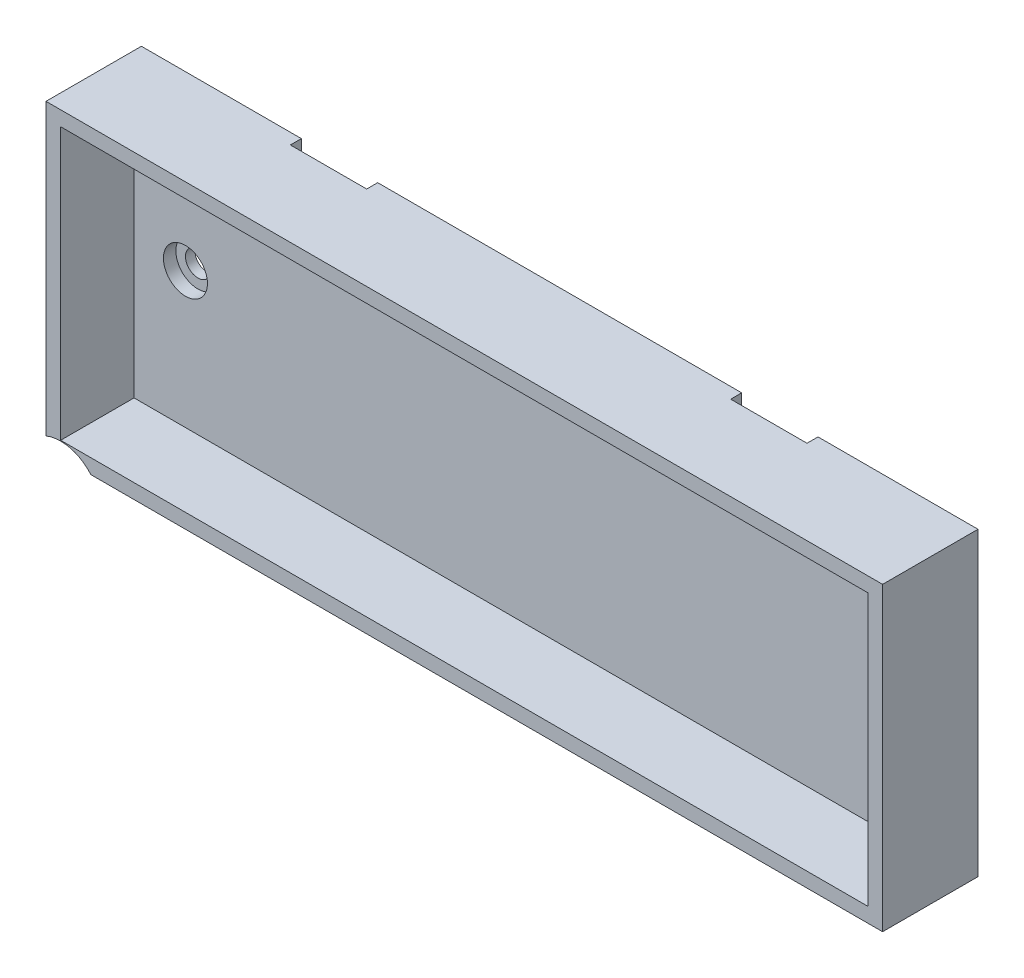
ISO-10303-21;
HEADER;
FILE_DESCRIPTION(('STEP AP214'),'2;1');
FILE_NAME('part.step','',(''),(''),'','','');
FILE_SCHEMA(('AUTOMOTIVE_DESIGN { 1 0 10303 214 1 1 1 1 }'));
ENDSEC;
DATA;
#1=APPLICATION_CONTEXT('core data for automotive mechanical design processes');
#2=APPLICATION_PROTOCOL_DEFINITION('international standard','automotive_design',2000,#1);
#3=PRODUCT_CONTEXT('',#1,'mechanical');
#4=PRODUCT('Part','Part','',(#3));
#5=PRODUCT_RELATED_PRODUCT_CATEGORY('part','',(#4));
#6=PRODUCT_DEFINITION_FORMATION('','',#4);
#7=PRODUCT_DEFINITION_CONTEXT('part definition',#1,'design');
#8=PRODUCT_DEFINITION('design','',#6,#7);
#9=PRODUCT_DEFINITION_SHAPE('','',#8);
#10=(LENGTH_UNIT() NAMED_UNIT(*) SI_UNIT(.MILLI.,.METRE.));
#11=(NAMED_UNIT(*) PLANE_ANGLE_UNIT() SI_UNIT($,.RADIAN.));
#12=(NAMED_UNIT(*) SI_UNIT($,.STERADIAN.) SOLID_ANGLE_UNIT());
#13=UNCERTAINTY_MEASURE_WITH_UNIT(LENGTH_MEASURE(1.E-05),#10,'distance_accuracy_value','');
#14=(GEOMETRIC_REPRESENTATION_CONTEXT(3) GLOBAL_UNCERTAINTY_ASSIGNED_CONTEXT((#13)) GLOBAL_UNIT_ASSIGNED_CONTEXT((#10,
#11,#12)) REPRESENTATION_CONTEXT('',''));
#15=CARTESIAN_POINT('',(0.,0.,0.));
#16=DIRECTION('',(0.,0.,1.));
#17=DIRECTION('',(1.,0.,0.));
#18=AXIS2_PLACEMENT_3D('',#15,#16,#17);
#19=CARTESIAN_POINT('',(-269.999999999999,-50.4999999999969,50.));
#20=DIRECTION('',(0.,0.,1.));
#21=DIRECTION('',(1.,0.,0.));
#22=AXIS2_PLACEMENT_3D('',#19,#20,#21);
#23=PLANE('',#22);
#24=DIRECTION('',(1.,0.,0.));
#25=VECTOR('',#24,1.);
#26=CARTESIAN_POINT('',(-265.88782296101,-47.,50.));
#27=LINE('',#26,#25);
#28=CARTESIAN_POINT('',(-250.2,-47.,50.));
#29=VERTEX_POINT('',#28);
#30=CARTESIAN_POINT('',(-239.8,-47.,50.));
#31=VERTEX_POINT('',#30);
#32=EDGE_CURVE('E264',#29,#31,#27,.T.);
#33=ORIENTED_EDGE('',*,*,#32,.F.);
#34=DIRECTION('',(0.,1.,0.));
#35=VECTOR('',#34,1.);
#36=CARTESIAN_POINT('',(-250.2,-6.,50.));
#37=LINE('',#36,#35);
#38=CARTESIAN_POINT('',(-250.2,-6.,50.));
#39=VERTEX_POINT('',#38);
#40=EDGE_CURVE('E230',#29,#39,#37,.T.);
#41=ORIENTED_EDGE('',*,*,#40,.T.);
#42=DIRECTION('',(-1.,0.,0.));
#43=VECTOR('',#42,1.);
#44=CARTESIAN_POINT('',(-272.,-6.,50.));
#45=LINE('',#44,#43);
#46=CARTESIAN_POINT('',(-239.8,-6.,50.));
#47=VERTEX_POINT('',#46);
#48=EDGE_CURVE('E266',#47,#39,#45,.T.);
#49=ORIENTED_EDGE('',*,*,#48,.F.);
#50=DIRECTION('',(0.,-1.,0.));
#51=VECTOR('',#50,1.);
#52=CARTESIAN_POINT('',(-239.8,-6.,50.));
#53=LINE('',#52,#51);
#54=EDGE_CURVE('E241',#47,#31,#53,.T.);
#55=ORIENTED_EDGE('',*,*,#54,.T.);
#56=EDGE_LOOP('',(#33,#41,#49,#55));
#57=FACE_BOUND('',#56,.T.);
#58=ADVANCED_FACE('F41',(#57),#23,.F.);
#59=CARTESIAN_POINT('',(-272.,-6.,51.5));
#60=DIRECTION('',(-1.,0.,0.));
#61=DIRECTION('',(0.,-1.,0.));
#62=AXIS2_PLACEMENT_3D('',#59,#60,#61);
#63=PLANE('',#62);
#64=DIRECTION('',(0.,-1.,0.));
#65=VECTOR('',#64,1.);
#66=CARTESIAN_POINT('',(-272.,-6.,61.5));
#67=LINE('',#66,#65);
#68=CARTESIAN_POINT('',(-272.,-6.,61.5));
#69=VERTEX_POINT('',#68);
#70=CARTESIAN_POINT('',(-272.,-45.4840255184067,61.5));
#71=VERTEX_POINT('',#70);
#72=EDGE_CURVE('E296',#69,#71,#67,.T.);
#73=ORIENTED_EDGE('',*,*,#72,.F.);
#74=DIRECTION('',(0.,0.,1.));
#75=VECTOR('',#74,1.);
#76=CARTESIAN_POINT('',(-272.,-6.,51.5));
#77=LINE('',#76,#75);
#78=CARTESIAN_POINT('',(-272.,-6.,48.5));
#79=VERTEX_POINT('',#78);
#80=EDGE_CURVE('E11',#79,#69,#77,.T.);
#81=ORIENTED_EDGE('',*,*,#80,.F.);
#82=DIRECTION('',(0.,-1.,0.));
#83=VECTOR('',#82,1.);
#84=CARTESIAN_POINT('',(-272.,-6.,48.5));
#85=LINE('',#84,#83);
#86=CARTESIAN_POINT('',(-272.,-45.4840255184067,48.5));
#87=VERTEX_POINT('',#86);
#88=EDGE_CURVE('E178',#79,#87,#85,.T.);
#89=ORIENTED_EDGE('',*,*,#88,.T.);
#90=DIRECTION('',(0.,0.,1.));
#91=VECTOR('',#90,1.);
#92=CARTESIAN_POINT('',(-272.,-45.4840255184067,51.5));
#93=LINE('',#92,#91);
#94=EDGE_CURVE('E44',#87,#71,#93,.T.);
#95=ORIENTED_EDGE('',*,*,#94,.T.);
#96=EDGE_LOOP('',(#73,#81,#89,#95));
#97=FACE_BOUND('',#96,.T.);
#98=ADVANCED_FACE('F43',(#97),#63,.T.);
#99=CARTESIAN_POINT('',(-272.,-6.,51.5));
#100=DIRECTION('',(0.,1.,0.));
#101=DIRECTION('',(0.,0.,1.));
#102=AXIS2_PLACEMENT_3D('',#99,#100,#101);
#103=PLANE('',#102);
#104=DIRECTION('',(-1.,0.,0.));
#105=VECTOR('',#104,1.);
#106=CARTESIAN_POINT('',(-272.,-6.,61.5));
#107=LINE('',#106,#105);
#108=CARTESIAN_POINT('',(-158.,-6.,61.5));
#109=VERTEX_POINT('',#108);
#110=EDGE_CURVE('E174',#109,#69,#107,.T.);
#111=ORIENTED_EDGE('',*,*,#110,.F.);
#112=DIRECTION('',(0.,0.,1.));
#113=VECTOR('',#112,1.);
#114=CARTESIAN_POINT('',(-158.,-6.,51.5));
#115=LINE('',#114,#113);
#116=CARTESIAN_POINT('',(-158.,-6.,48.5));
#117=VERTEX_POINT('',#116);
#118=EDGE_CURVE('E49',#117,#109,#115,.T.);
#119=ORIENTED_EDGE('',*,*,#118,.F.);
#120=DIRECTION('',(-1.,0.,0.));
#121=VECTOR('',#120,1.);
#122=CARTESIAN_POINT('',(-179.8,-6.,48.5));
#123=LINE('',#122,#121);
#124=CARTESIAN_POINT('',(-179.8,-6.,48.5));
#125=VERTEX_POINT('',#124);
#126=EDGE_CURVE('E211',#117,#125,#123,.T.);
#127=ORIENTED_EDGE('',*,*,#126,.T.);
#128=DIRECTION('',(0.,0.,1.));
#129=VECTOR('',#128,1.);
#130=CARTESIAN_POINT('',(-179.8,-6.,49.8));
#131=LINE('',#130,#129);
#132=CARTESIAN_POINT('',(-179.8,-6.,50.));
#133=VERTEX_POINT('',#132);
#134=EDGE_CURVE('E239',#125,#133,#131,.T.);
#135=ORIENTED_EDGE('',*,*,#134,.T.);
#136=CARTESIAN_POINT('',(-190.2,-6.,50.));
#137=VERTEX_POINT('',#136);
#138=EDGE_CURVE('E267',#133,#137,#45,.T.);
#139=ORIENTED_EDGE('',*,*,#138,.T.);
#140=DIRECTION('',(0.,0.,1.));
#141=VECTOR('',#140,1.);
#142=CARTESIAN_POINT('',(-190.2,-6.,49.8));
#143=LINE('',#142,#141);
#144=CARTESIAN_POINT('',(-190.2,-6.,48.5));
#145=VERTEX_POINT('',#144);
#146=EDGE_CURVE('E250',#145,#137,#143,.T.);
#147=ORIENTED_EDGE('',*,*,#146,.F.);
#148=DIRECTION('',(-1.,0.,0.));
#149=VECTOR('',#148,1.);
#150=CARTESIAN_POINT('',(-239.8,-6.,48.5));
#151=LINE('',#150,#149);
#152=CARTESIAN_POINT('',(-239.8,-6.,48.5));
#153=VERTEX_POINT('',#152);
#154=EDGE_CURVE('E196',#145,#153,#151,.T.);
#155=ORIENTED_EDGE('',*,*,#154,.T.);
#156=DIRECTION('',(0.,0.,1.));
#157=VECTOR('',#156,1.);
#158=CARTESIAN_POINT('',(-239.8,-6.,49.8));
#159=LINE('',#158,#157);
#160=EDGE_CURVE('E197',#153,#47,#159,.T.);
#161=ORIENTED_EDGE('',*,*,#160,.T.);
#162=ORIENTED_EDGE('',*,*,#48,.T.);
#163=DIRECTION('',(0.,0.,1.));
#164=VECTOR('',#163,1.);
#165=CARTESIAN_POINT('',(-250.2,-6.,49.8));
#166=LINE('',#165,#164);
#167=CARTESIAN_POINT('',(-250.2,-6.,48.5));
#168=VERTEX_POINT('',#167);
#169=EDGE_CURVE('E66',#168,#39,#166,.T.);
#170=ORIENTED_EDGE('',*,*,#169,.F.);
#171=DIRECTION('',(-1.,0.,0.));
#172=VECTOR('',#171,1.);
#173=CARTESIAN_POINT('',(-272.,-6.,48.5));
#174=LINE('',#173,#172);
#175=EDGE_CURVE('E195',#168,#79,#174,.T.);
#176=ORIENTED_EDGE('',*,*,#175,.T.);
#177=ORIENTED_EDGE('',*,*,#80,.T.);
#178=EDGE_LOOP('',(#111,#119,#127,#135,#139,#147,#155,#161,#162,#170,#176,#177));
#179=FACE_BOUND('',#178,.T.);
#180=ADVANCED_FACE('F323',(#179),#103,.T.);
#181=CARTESIAN_POINT('',(-158.,-6.,51.5));
#182=DIRECTION('',(1.,0.,0.));
#183=DIRECTION('',(0.,0.,-1.));
#184=AXIS2_PLACEMENT_3D('',#181,#182,#183);
#185=PLANE('',#184);
#186=DIRECTION('',(0.,1.,0.));
#187=VECTOR('',#186,1.);
#188=CARTESIAN_POINT('',(-158.,-6.,61.5));
#189=LINE('',#188,#187);
#190=CARTESIAN_POINT('',(-158.,-47.,61.5));
#191=VERTEX_POINT('',#190);
#192=EDGE_CURVE('E306',#191,#109,#189,.T.);
#193=ORIENTED_EDGE('',*,*,#192,.F.);
#194=DIRECTION('',(0.,0.,1.));
#195=VECTOR('',#194,1.);
#196=CARTESIAN_POINT('',(-158.,-47.,51.5));
#197=LINE('',#196,#195);
#198=CARTESIAN_POINT('',(-158.,-47.,48.5));
#199=VERTEX_POINT('',#198);
#200=EDGE_CURVE('E314',#199,#191,#197,.T.);
#201=ORIENTED_EDGE('',*,*,#200,.F.);
#202=DIRECTION('',(0.,1.,0.));
#203=VECTOR('',#202,1.);
#204=CARTESIAN_POINT('',(-158.,-6.,48.5));
#205=LINE('',#204,#203);
#206=EDGE_CURVE('E212',#199,#117,#205,.T.);
#207=ORIENTED_EDGE('',*,*,#206,.T.);
#208=ORIENTED_EDGE('',*,*,#118,.T.);
#209=EDGE_LOOP('',(#193,#201,#207,#208));
#210=FACE_BOUND('',#209,.T.);
#211=ADVANCED_FACE('F353',(#210),#185,.T.);
#212=CARTESIAN_POINT('',(-265.88782296101,-47.,51.5));
#213=DIRECTION('',(0.,-1.,0.));
#214=DIRECTION('',(0.,0.,-1.));
#215=AXIS2_PLACEMENT_3D('',#212,#213,#214);
#216=PLANE('',#215);
#217=DIRECTION('',(1.,0.,0.));
#218=VECTOR('',#217,1.);
#219=CARTESIAN_POINT('',(-265.88782296101,-47.,61.5));
#220=LINE('',#219,#218);
#221=CARTESIAN_POINT('',(-265.88782296101,-47.,61.5));
#222=VERTEX_POINT('',#221);
#223=EDGE_CURVE('E305',#222,#191,#220,.T.);
#224=ORIENTED_EDGE('',*,*,#223,.F.);
#225=DIRECTION('',(0.,0.,1.));
#226=VECTOR('',#225,1.);
#227=CARTESIAN_POINT('',(-265.88782296101,-47.,51.5));
#228=LINE('',#227,#226);
#229=CARTESIAN_POINT('',(-265.88782296101,-47.,48.5));
#230=VERTEX_POINT('',#229);
#231=EDGE_CURVE('E172',#230,#222,#228,.T.);
#232=ORIENTED_EDGE('',*,*,#231,.F.);
#233=DIRECTION('',(1.,0.,0.));
#234=VECTOR('',#233,1.);
#235=CARTESIAN_POINT('',(-265.88782296101,-47.,48.5));
#236=LINE('',#235,#234);
#237=CARTESIAN_POINT('',(-250.2,-47.,48.5));
#238=VERTEX_POINT('',#237);
#239=EDGE_CURVE('E181',#230,#238,#236,.T.);
#240=ORIENTED_EDGE('',*,*,#239,.T.);
#241=DIRECTION('',(0.,0.,1.));
#242=VECTOR('',#241,1.);
#243=CARTESIAN_POINT('',(-250.2,-47.,49.8));
#244=LINE('',#243,#242);
#245=EDGE_CURVE('E234',#238,#29,#244,.T.);
#246=ORIENTED_EDGE('',*,*,#245,.T.);
#247=ORIENTED_EDGE('',*,*,#32,.T.);
#248=DIRECTION('',(0.,0.,1.));
#249=VECTOR('',#248,1.);
#250=CARTESIAN_POINT('',(-239.8,-47.,49.8));
#251=LINE('',#250,#249);
#252=CARTESIAN_POINT('',(-239.8,-47.,48.5));
#253=VERTEX_POINT('',#252);
#254=EDGE_CURVE('E245',#253,#31,#251,.T.);
#255=ORIENTED_EDGE('',*,*,#254,.F.);
#256=DIRECTION('',(1.,0.,0.));
#257=VECTOR('',#256,1.);
#258=CARTESIAN_POINT('',(-239.8,-47.,48.5));
#259=LINE('',#258,#257);
#260=CARTESIAN_POINT('',(-190.2,-47.,48.5));
#261=VERTEX_POINT('',#260);
#262=EDGE_CURVE('E202',#253,#261,#259,.T.);
#263=ORIENTED_EDGE('',*,*,#262,.T.);
#264=DIRECTION('',(0.,0.,1.));
#265=VECTOR('',#264,1.);
#266=CARTESIAN_POINT('',(-190.2,-47.,49.8));
#267=LINE('',#266,#265);
#268=CARTESIAN_POINT('',(-190.2,-47.,50.));
#269=VERTEX_POINT('',#268);
#270=EDGE_CURVE('E249',#261,#269,#267,.T.);
#271=ORIENTED_EDGE('',*,*,#270,.T.);
#272=CARTESIAN_POINT('',(-179.8,-47.,50.));
#273=VERTEX_POINT('',#272);
#274=EDGE_CURVE('E265',#269,#273,#27,.T.);
#275=ORIENTED_EDGE('',*,*,#274,.T.);
#276=DIRECTION('',(0.,0.,1.));
#277=VECTOR('',#276,1.);
#278=CARTESIAN_POINT('',(-179.8,-47.,49.8));
#279=LINE('',#278,#277);
#280=CARTESIAN_POINT('',(-179.8,-47.,48.5));
#281=VERTEX_POINT('',#280);
#282=EDGE_CURVE('E59',#281,#273,#279,.T.);
#283=ORIENTED_EDGE('',*,*,#282,.F.);
#284=DIRECTION('',(1.,0.,0.));
#285=VECTOR('',#284,1.);
#286=CARTESIAN_POINT('',(-179.8,-47.,48.5));
#287=LINE('',#286,#285);
#288=EDGE_CURVE('E220',#281,#199,#287,.T.);
#289=ORIENTED_EDGE('',*,*,#288,.T.);
#290=ORIENTED_EDGE('',*,*,#200,.T.);
#291=EDGE_LOOP('',(#224,#232,#240,#246,#247,#255,#263,#271,#275,#283,#289,#290));
#292=FACE_BOUND('',#291,.T.);
#293=ADVANCED_FACE('F320',(#292),#216,.T.);
#294=CARTESIAN_POINT('',(-269.999999999999,-50.4999999999969,51.5));
#295=DIRECTION('',(0.,0.,1.));
#296=DIRECTION('',(1.,0.,0.));
#297=AXIS2_PLACEMENT_3D('',#294,#295,#296);
#298=CYLINDRICAL_SURFACE('',#297,5.399999999997);
#299=CARTESIAN_POINT('',(-269.999999999999,-50.4999999999969,61.5));
#300=DIRECTION('',(0.,0.,-1.));
#301=DIRECTION('',(1.,0.,0.));
#302=AXIS2_PLACEMENT_3D('',#299,#300,#301);
#303=CIRCLE('',#302,5.399999999997);
#304=EDGE_CURVE('E170',#71,#222,#303,.T.);
#305=ORIENTED_EDGE('',*,*,#304,.F.);
#306=ORIENTED_EDGE('',*,*,#94,.F.);
#307=CARTESIAN_POINT('',(-269.999999999999,-50.4999999999969,48.5));
#308=DIRECTION('',(0.,0.,-1.));
#309=DIRECTION('',(1.,0.,0.));
#310=AXIS2_PLACEMENT_3D('',#307,#308,#309);
#311=CIRCLE('',#310,5.399999999997);
#312=EDGE_CURVE('E164',#87,#230,#311,.T.);
#313=ORIENTED_EDGE('',*,*,#312,.T.);
#314=ORIENTED_EDGE('',*,*,#231,.T.);
#315=EDGE_LOOP('',(#305,#306,#313,#314));
#316=FACE_BOUND('',#315,.T.);
#317=ADVANCED_FACE('F163',(#316),#298,.F.);
#318=CARTESIAN_POINT('',(-269.999999999999,-50.4999999999969,61.5));
#319=DIRECTION('',(0.,0.,1.));
#320=DIRECTION('',(1.,0.,0.));
#321=AXIS2_PLACEMENT_3D('',#318,#319,#320);
#322=PLANE('',#321);
#323=DIRECTION('',(-1.,0.,0.));
#324=VECTOR('',#323,1.);
#325=CARTESIAN_POINT('',(-270.,-8.,61.5));
#326=LINE('',#325,#324);
#327=CARTESIAN_POINT('',(-160.,-8.,61.5));
#328=VERTEX_POINT('',#327);
#329=CARTESIAN_POINT('',(-270.,-8.,61.5));
#330=VERTEX_POINT('',#329);
#331=EDGE_CURVE('E283',#328,#330,#326,.T.);
#332=ORIENTED_EDGE('',*,*,#331,.F.);
#333=DIRECTION('',(0.,1.,0.));
#334=VECTOR('',#333,1.);
#335=CARTESIAN_POINT('',(-160.,-8.,61.5));
#336=LINE('',#335,#334);
#337=CARTESIAN_POINT('',(-160.,-45.,61.5));
#338=VERTEX_POINT('',#337);
#339=EDGE_CURVE('E273',#338,#328,#336,.T.);
#340=ORIENTED_EDGE('',*,*,#339,.F.);
#341=DIRECTION('',(1.,0.,0.));
#342=VECTOR('',#341,1.);
#343=CARTESIAN_POINT('',(-270.,-45.,61.5));
#344=LINE('',#343,#342);
#345=CARTESIAN_POINT('',(-270.,-45.,61.5));
#346=VERTEX_POINT('',#345);
#347=EDGE_CURVE('E288',#346,#338,#344,.T.);
#348=ORIENTED_EDGE('',*,*,#347,.F.);
#349=DIRECTION('',(0.,-1.,0.));
#350=VECTOR('',#349,1.);
#351=CARTESIAN_POINT('',(-270.,-8.,61.5));
#352=LINE('',#351,#350);
#353=EDGE_CURVE('E286',#330,#346,#352,.T.);
#354=ORIENTED_EDGE('',*,*,#353,.F.);
#355=EDGE_LOOP('',(#332,#340,#348,#354));
#356=FACE_BOUND('',#355,.T.);
#357=ORIENTED_EDGE('',*,*,#72,.T.);
#358=ORIENTED_EDGE('',*,*,#304,.T.);
#359=ORIENTED_EDGE('',*,*,#223,.T.);
#360=ORIENTED_EDGE('',*,*,#192,.T.);
#361=ORIENTED_EDGE('',*,*,#110,.T.);
#362=EDGE_LOOP('',(#357,#358,#359,#360,#361));
#363=FACE_BOUND('',#362,.T.);
#364=ADVANCED_FACE('F319',(#356,#363),#322,.T.);
#365=CARTESIAN_POINT('',(-270.,-8.,51.5));
#366=DIRECTION('',(0.,1.,0.));
#367=DIRECTION('',(0.,0.,1.));
#368=AXIS2_PLACEMENT_3D('',#365,#366,#367);
#369=PLANE('',#368);
#370=ORIENTED_EDGE('',*,*,#331,.T.);
#371=DIRECTION('',(0.,0.,1.));
#372=VECTOR('',#371,1.);
#373=CARTESIAN_POINT('',(-270.,-8.,51.5));
#374=LINE('',#373,#372);
#375=CARTESIAN_POINT('',(-270.,-8.,51.5));
#376=VERTEX_POINT('',#375);
#377=EDGE_CURVE('E284',#376,#330,#374,.T.);
#378=ORIENTED_EDGE('',*,*,#377,.F.);
#379=DIRECTION('',(-1.,0.,0.));
#380=VECTOR('',#379,1.);
#381=CARTESIAN_POINT('',(-270.,-8.,51.5));
#382=LINE('',#381,#380);
#383=CARTESIAN_POINT('',(-160.,-8.,51.5));
#384=VERTEX_POINT('',#383);
#385=EDGE_CURVE('E269',#384,#376,#382,.T.);
#386=ORIENTED_EDGE('',*,*,#385,.F.);
#387=DIRECTION('',(0.,0.,1.));
#388=VECTOR('',#387,1.);
#389=CARTESIAN_POINT('',(-160.,-8.,51.5));
#390=LINE('',#389,#388);
#391=EDGE_CURVE('E294',#384,#328,#390,.T.);
#392=ORIENTED_EDGE('',*,*,#391,.T.);
#393=EDGE_LOOP('',(#370,#378,#386,#392));
#394=FACE_BOUND('',#393,.T.);
#395=ADVANCED_FACE('F391',(#394),#369,.F.);
#396=CARTESIAN_POINT('',(-160.,-8.,51.5));
#397=DIRECTION('',(1.,0.,0.));
#398=DIRECTION('',(0.,0.,-1.));
#399=AXIS2_PLACEMENT_3D('',#396,#397,#398);
#400=PLANE('',#399);
#401=ORIENTED_EDGE('',*,*,#339,.T.);
#402=ORIENTED_EDGE('',*,*,#391,.F.);
#403=DIRECTION('',(0.,1.,0.));
#404=VECTOR('',#403,1.);
#405=CARTESIAN_POINT('',(-160.,-8.,51.5));
#406=LINE('',#405,#404);
#407=CARTESIAN_POINT('',(-160.,-45.,51.5));
#408=VERTEX_POINT('',#407);
#409=EDGE_CURVE('E278',#408,#384,#406,.T.);
#410=ORIENTED_EDGE('',*,*,#409,.F.);
#411=DIRECTION('',(0.,0.,1.));
#412=VECTOR('',#411,1.);
#413=CARTESIAN_POINT('',(-160.,-45.,51.5));
#414=LINE('',#413,#412);
#415=EDGE_CURVE('E297',#408,#338,#414,.T.);
#416=ORIENTED_EDGE('',*,*,#415,.T.);
#417=EDGE_LOOP('',(#401,#402,#410,#416));
#418=FACE_BOUND('',#417,.T.);
#419=ADVANCED_FACE('F387',(#418),#400,.F.);
#420=CARTESIAN_POINT('',(-270.,-45.,51.5));
#421=DIRECTION('',(0.,-1.,0.));
#422=DIRECTION('',(0.,0.,-1.));
#423=AXIS2_PLACEMENT_3D('',#420,#421,#422);
#424=PLANE('',#423);
#425=ORIENTED_EDGE('',*,*,#347,.T.);
#426=ORIENTED_EDGE('',*,*,#415,.F.);
#427=DIRECTION('',(1.,0.,0.));
#428=VECTOR('',#427,1.);
#429=CARTESIAN_POINT('',(-270.,-45.,51.5));
#430=LINE('',#429,#428);
#431=CARTESIAN_POINT('',(-270.,-45.,51.5));
#432=VERTEX_POINT('',#431);
#433=EDGE_CURVE('E280',#432,#408,#430,.T.);
#434=ORIENTED_EDGE('',*,*,#433,.F.);
#435=DIRECTION('',(0.,0.,1.));
#436=VECTOR('',#435,1.);
#437=CARTESIAN_POINT('',(-270.,-45.,51.5));
#438=LINE('',#437,#436);
#439=EDGE_CURVE('E298',#432,#346,#438,.T.);
#440=ORIENTED_EDGE('',*,*,#439,.T.);
#441=EDGE_LOOP('',(#425,#426,#434,#440));
#442=FACE_BOUND('',#441,.T.);
#443=ADVANCED_FACE('F379',(#442),#424,.F.);
#444=CARTESIAN_POINT('',(-270.,-8.,51.5));
#445=DIRECTION('',(-1.,0.,0.));
#446=DIRECTION('',(0.,0.,1.));
#447=AXIS2_PLACEMENT_3D('',#444,#445,#446);
#448=PLANE('',#447);
#449=ORIENTED_EDGE('',*,*,#353,.T.);
#450=ORIENTED_EDGE('',*,*,#439,.F.);
#451=DIRECTION('',(0.,-1.,0.));
#452=VECTOR('',#451,1.);
#453=CARTESIAN_POINT('',(-270.,-8.,51.5));
#454=LINE('',#453,#452);
#455=EDGE_CURVE('E272',#376,#432,#454,.T.);
#456=ORIENTED_EDGE('',*,*,#455,.F.);
#457=ORIENTED_EDGE('',*,*,#377,.T.);
#458=EDGE_LOOP('',(#449,#450,#456,#457));
#459=FACE_BOUND('',#458,.T.);
#460=ADVANCED_FACE('F373',(#459),#448,.F.);
#461=ORIENTED_EDGE('',*,*,#138,.F.);
#462=DIRECTION('',(0.,-1.,0.));
#463=VECTOR('',#462,1.);
#464=CARTESIAN_POINT('',(-179.8,-6.,50.));
#465=LINE('',#464,#463);
#466=EDGE_CURVE('E236',#133,#273,#465,.T.);
#467=ORIENTED_EDGE('',*,*,#466,.T.);
#468=ORIENTED_EDGE('',*,*,#274,.F.);
#469=DIRECTION('',(0.,1.,0.));
#470=VECTOR('',#469,1.);
#471=CARTESIAN_POINT('',(-190.2,-6.,50.));
#472=LINE('',#471,#470);
#473=EDGE_CURVE('E247',#269,#137,#472,.T.);
#474=ORIENTED_EDGE('',*,*,#473,.T.);
#475=EDGE_LOOP('',(#461,#467,#468,#474));
#476=FACE_BOUND('',#475,.T.);
#477=ADVANCED_FACE('F345',(#476),#23,.F.);
#478=CARTESIAN_POINT('',(-269.999999999999,-50.4999999999969,51.5));
#479=DIRECTION('',(0.,0.,1.));
#480=DIRECTION('',(1.,0.,0.));
#481=AXIS2_PLACEMENT_3D('',#478,#479,#480);
#482=PLANE('',#481);
#483=ORIENTED_EDGE('',*,*,#433,.T.);
#484=ORIENTED_EDGE('',*,*,#409,.T.);
#485=ORIENTED_EDGE('',*,*,#385,.T.);
#486=ORIENTED_EDGE('',*,*,#455,.T.);
#487=EDGE_LOOP('',(#483,#484,#485,#486));
#488=FACE_BOUND('',#487,.T.);
#489=CARTESIAN_POINT('',(-167.,-26.5,51.5));
#490=DIRECTION('',(0.,0.,1.));
#491=DIRECTION('',(1.,0.,0.));
#492=AXIS2_PLACEMENT_3D('',#489,#490,#491);
#493=CIRCLE('',#492,3.);
#494=CARTESIAN_POINT('',(-164.,-26.5,51.5));
#495=VERTEX_POINT('',#494);
#496=EDGE_CURVE('E235',#495,#495,#493,.T.);
#497=ORIENTED_EDGE('',*,*,#496,.F.);
#498=EDGE_LOOP('',(#497));
#499=FACE_BOUND('',#498,.T.);
#500=CARTESIAN_POINT('',(-263.,-26.5,51.5));
#501=DIRECTION('',(0.,0.,1.));
#502=DIRECTION('',(1.,0.,0.));
#503=AXIS2_PLACEMENT_3D('',#500,#501,#502);
#504=CIRCLE('',#503,3.);
#505=CARTESIAN_POINT('',(-260.,-26.5,51.5));
#506=VERTEX_POINT('',#505);
#507=EDGE_CURVE('E259',#506,#506,#504,.T.);
#508=ORIENTED_EDGE('',*,*,#507,.F.);
#509=EDGE_LOOP('',(#508));
#510=FACE_BOUND('',#509,.T.);
#511=ADVANCED_FACE('F375',(#488,#499,#510),#482,.T.);
#512=CARTESIAN_POINT('',(-263.,-26.5,50.));
#513=DIRECTION('',(0.,0.,1.));
#514=DIRECTION('',(1.,0.,0.));
#515=AXIS2_PLACEMENT_3D('',#512,#513,#514);
#516=CYLINDRICAL_SURFACE('',#515,3.);
#517=ORIENTED_EDGE('',*,*,#507,.T.);
#518=EDGE_LOOP('',(#517));
#519=FACE_BOUND('',#518,.T.);
#520=CARTESIAN_POINT('',(-263.,-26.5,49.8));
#521=DIRECTION('',(0.,0.,1.));
#522=DIRECTION('',(1.,0.,0.));
#523=AXIS2_PLACEMENT_3D('',#520,#521,#522);
#524=CIRCLE('',#523,3.);
#525=CARTESIAN_POINT('',(-260.,-26.5,49.8));
#526=VERTEX_POINT('',#525);
#527=EDGE_CURVE('E227',#526,#526,#524,.T.);
#528=ORIENTED_EDGE('',*,*,#527,.F.);
#529=EDGE_LOOP('',(#528));
#530=FACE_BOUND('',#529,.T.);
#531=ADVANCED_FACE('F380',(#519,#530),#516,.F.);
#532=CARTESIAN_POINT('',(-167.,-26.5,50.));
#533=DIRECTION('',(0.,0.,1.));
#534=DIRECTION('',(1.,0.,0.));
#535=AXIS2_PLACEMENT_3D('',#532,#533,#534);
#536=CYLINDRICAL_SURFACE('',#535,3.);
#537=ORIENTED_EDGE('',*,*,#496,.T.);
#538=EDGE_LOOP('',(#537));
#539=FACE_BOUND('',#538,.T.);
#540=CARTESIAN_POINT('',(-167.,-26.5,49.8));
#541=DIRECTION('',(0.,0.,1.));
#542=DIRECTION('',(1.,0.,0.));
#543=AXIS2_PLACEMENT_3D('',#540,#541,#542);
#544=CIRCLE('',#543,3.);
#545=CARTESIAN_POINT('',(-164.,-26.5,49.8));
#546=VERTEX_POINT('',#545);
#547=EDGE_CURVE('E231',#546,#546,#544,.T.);
#548=ORIENTED_EDGE('',*,*,#547,.F.);
#549=EDGE_LOOP('',(#548));
#550=FACE_BOUND('',#549,.T.);
#551=ADVANCED_FACE('F501',(#539,#550),#536,.F.);
#552=CARTESIAN_POINT('',(-239.8,-6.,49.8));
#553=DIRECTION('',(-1.,0.,0.));
#554=DIRECTION('',(0.,0.,1.));
#555=AXIS2_PLACEMENT_3D('',#552,#553,#554);
#556=PLANE('',#555);
#557=ORIENTED_EDGE('',*,*,#54,.F.);
#558=ORIENTED_EDGE('',*,*,#160,.F.);
#559=DIRECTION('',(0.,-1.,0.));
#560=VECTOR('',#559,1.);
#561=CARTESIAN_POINT('',(-239.8,-6.,48.5));
#562=LINE('',#561,#560);
#563=EDGE_CURVE('E208',#153,#253,#562,.T.);
#564=ORIENTED_EDGE('',*,*,#563,.T.);
#565=ORIENTED_EDGE('',*,*,#254,.T.);
#566=EDGE_LOOP('',(#557,#558,#564,#565));
#567=FACE_BOUND('',#566,.T.);
#568=ADVANCED_FACE('F332',(#567),#556,.T.);
#569=CARTESIAN_POINT('',(-190.2,-6.,49.8));
#570=DIRECTION('',(1.,0.,0.));
#571=DIRECTION('',(0.,0.,-1.));
#572=AXIS2_PLACEMENT_3D('',#569,#570,#571);
#573=PLANE('',#572);
#574=ORIENTED_EDGE('',*,*,#473,.F.);
#575=ORIENTED_EDGE('',*,*,#270,.F.);
#576=DIRECTION('',(0.,1.,0.));
#577=VECTOR('',#576,1.);
#578=CARTESIAN_POINT('',(-190.2,-6.,48.5));
#579=LINE('',#578,#577);
#580=EDGE_CURVE('E203',#261,#145,#579,.T.);
#581=ORIENTED_EDGE('',*,*,#580,.T.);
#582=ORIENTED_EDGE('',*,*,#146,.T.);
#583=EDGE_LOOP('',(#574,#575,#581,#582));
#584=FACE_BOUND('',#583,.T.);
#585=ADVANCED_FACE('F340',(#584),#573,.T.);
#586=CARTESIAN_POINT('',(-179.8,-6.,49.8));
#587=DIRECTION('',(-1.,0.,0.));
#588=DIRECTION('',(0.,0.,1.));
#589=AXIS2_PLACEMENT_3D('',#586,#587,#588);
#590=PLANE('',#589);
#591=ORIENTED_EDGE('',*,*,#466,.F.);
#592=ORIENTED_EDGE('',*,*,#134,.F.);
#593=DIRECTION('',(0.,-1.,0.));
#594=VECTOR('',#593,1.);
#595=CARTESIAN_POINT('',(-179.8,-6.,48.5));
#596=LINE('',#595,#594);
#597=EDGE_CURVE('E219',#125,#281,#596,.T.);
#598=ORIENTED_EDGE('',*,*,#597,.T.);
#599=ORIENTED_EDGE('',*,*,#282,.T.);
#600=EDGE_LOOP('',(#591,#592,#598,#599));
#601=FACE_BOUND('',#600,.T.);
#602=ADVANCED_FACE('F350',(#601),#590,.T.);
#603=CARTESIAN_POINT('',(-250.2,-6.,49.8));
#604=DIRECTION('',(1.,0.,0.));
#605=DIRECTION('',(0.,0.,-1.));
#606=AXIS2_PLACEMENT_3D('',#603,#604,#605);
#607=PLANE('',#606);
#608=ORIENTED_EDGE('',*,*,#40,.F.);
#609=ORIENTED_EDGE('',*,*,#245,.F.);
#610=DIRECTION('',(0.,1.,0.));
#611=VECTOR('',#610,1.);
#612=CARTESIAN_POINT('',(-250.2,-6.,48.5));
#613=LINE('',#612,#611);
#614=EDGE_CURVE('E194',#238,#168,#613,.T.);
#615=ORIENTED_EDGE('',*,*,#614,.T.);
#616=ORIENTED_EDGE('',*,*,#169,.T.);
#617=EDGE_LOOP('',(#608,#609,#615,#616));
#618=FACE_BOUND('',#617,.T.);
#619=ADVANCED_FACE('F326',(#618),#607,.T.);
#620=CARTESIAN_POINT('',(0.,0.,49.8));
#621=DIRECTION('',(0.,0.,1.));
#622=DIRECTION('',(1.,0.,0.));
#623=AXIS2_PLACEMENT_3D('',#620,#621,#622);
#624=PLANE('',#623);
#625=CARTESIAN_POINT('',(-167.,-26.5,49.8));
#626=DIRECTION('',(0.,0.,1.));
#627=DIRECTION('',(1.,0.,0.));
#628=AXIS2_PLACEMENT_3D('',#625,#626,#627);
#629=CIRCLE('',#628,1.70000000000001);
#630=CARTESIAN_POINT('',(-165.3,-26.5,49.8));
#631=VERTEX_POINT('',#630);
#632=EDGE_CURVE('E205',#631,#631,#629,.T.);
#633=ORIENTED_EDGE('',*,*,#632,.F.);
#634=EDGE_LOOP('',(#633));
#635=FACE_BOUND('',#634,.T.);
#636=ORIENTED_EDGE('',*,*,#547,.T.);
#637=EDGE_LOOP('',(#636));
#638=FACE_BOUND('',#637,.T.);
#639=ADVANCED_FACE('F547',(#635,#638),#624,.T.);
#640=CARTESIAN_POINT('',(0.,0.,48.5));
#641=DIRECTION('',(0.,0.,1.));
#642=DIRECTION('',(1.,0.,0.));
#643=AXIS2_PLACEMENT_3D('',#640,#641,#642);
#644=PLANE('',#643);
#645=CARTESIAN_POINT('',(-167.,-26.5,48.5));
#646=DIRECTION('',(0.,0.,1.));
#647=DIRECTION('',(1.,0.,0.));
#648=AXIS2_PLACEMENT_3D('',#645,#646,#647);
#649=CIRCLE('',#648,1.70000000000001);
#650=CARTESIAN_POINT('',(-165.3,-26.5,48.5));
#651=VERTEX_POINT('',#650);
#652=EDGE_CURVE('E225',#651,#651,#649,.T.);
#653=ORIENTED_EDGE('',*,*,#652,.T.);
#654=EDGE_LOOP('',(#653));
#655=FACE_BOUND('',#654,.T.);
#656=ORIENTED_EDGE('',*,*,#597,.F.);
#657=ORIENTED_EDGE('',*,*,#126,.F.);
#658=ORIENTED_EDGE('',*,*,#206,.F.);
#659=ORIENTED_EDGE('',*,*,#288,.F.);
#660=EDGE_LOOP('',(#656,#657,#658,#659));
#661=FACE_BOUND('',#660,.T.);
#662=ADVANCED_FACE('F351',(#655,#661),#644,.F.);
#663=CARTESIAN_POINT('',(-167.,-26.5,48.5));
#664=DIRECTION('',(0.,0.,1.));
#665=DIRECTION('',(1.,0.,0.));
#666=AXIS2_PLACEMENT_3D('',#663,#664,#665);
#667=CYLINDRICAL_SURFACE('',#666,1.70000000000001);
#668=ORIENTED_EDGE('',*,*,#652,.F.);
#669=EDGE_LOOP('',(#668));
#670=FACE_BOUND('',#669,.T.);
#671=ORIENTED_EDGE('',*,*,#632,.T.);
#672=EDGE_LOOP('',(#671));
#673=FACE_BOUND('',#672,.T.);
#674=ADVANCED_FACE('F565',(#670,#673),#667,.F.);
#675=CARTESIAN_POINT('',(-269.999999999999,-50.4999999999969,49.8));
#676=DIRECTION('',(0.,0.,1.));
#677=DIRECTION('',(1.,0.,0.));
#678=AXIS2_PLACEMENT_3D('',#675,#676,#677);
#679=PLANE('',#678);
#680=CARTESIAN_POINT('',(-263.,-26.5,49.8));
#681=DIRECTION('',(0.,0.,1.));
#682=DIRECTION('',(1.,0.,0.));
#683=AXIS2_PLACEMENT_3D('',#680,#681,#682);
#684=CIRCLE('',#683,1.69999999999998);
#685=CARTESIAN_POINT('',(-261.3,-26.5,49.8));
#686=VERTEX_POINT('',#685);
#687=EDGE_CURVE('E189',#686,#686,#684,.T.);
#688=ORIENTED_EDGE('',*,*,#687,.F.);
#689=EDGE_LOOP('',(#688));
#690=FACE_BOUND('',#689,.T.);
#691=ORIENTED_EDGE('',*,*,#527,.T.);
#692=EDGE_LOOP('',(#691));
#693=FACE_BOUND('',#692,.T.);
#694=ADVANCED_FACE('F573',(#690,#693),#679,.T.);
#695=CARTESIAN_POINT('',(-269.999999999999,-50.4999999999969,48.5));
#696=DIRECTION('',(0.,0.,1.));
#697=DIRECTION('',(1.,0.,0.));
#698=AXIS2_PLACEMENT_3D('',#695,#696,#697);
#699=PLANE('',#698);
#700=CARTESIAN_POINT('',(-263.,-26.5,48.5));
#701=DIRECTION('',(0.,0.,1.));
#702=DIRECTION('',(1.,0.,0.));
#703=AXIS2_PLACEMENT_3D('',#700,#701,#702);
#704=CIRCLE('',#703,1.69999999999998);
#705=CARTESIAN_POINT('',(-261.3,-26.5,48.5));
#706=VERTEX_POINT('',#705);
#707=EDGE_CURVE('E183',#706,#706,#704,.T.);
#708=ORIENTED_EDGE('',*,*,#707,.T.);
#709=EDGE_LOOP('',(#708));
#710=FACE_BOUND('',#709,.T.);
#711=ORIENTED_EDGE('',*,*,#88,.F.);
#712=ORIENTED_EDGE('',*,*,#175,.F.);
#713=ORIENTED_EDGE('',*,*,#614,.F.);
#714=ORIENTED_EDGE('',*,*,#239,.F.);
#715=ORIENTED_EDGE('',*,*,#312,.F.);
#716=EDGE_LOOP('',(#711,#712,#713,#714,#715));
#717=FACE_BOUND('',#716,.T.);
#718=ADVANCED_FACE('F177',(#710,#717),#699,.F.);
#719=CARTESIAN_POINT('',(-263.,-26.5,48.5));
#720=DIRECTION('',(0.,0.,1.));
#721=DIRECTION('',(1.,0.,0.));
#722=AXIS2_PLACEMENT_3D('',#719,#720,#721);
#723=CYLINDRICAL_SURFACE('',#722,1.69999999999998);
#724=ORIENTED_EDGE('',*,*,#707,.F.);
#725=EDGE_LOOP('',(#724));
#726=FACE_BOUND('',#725,.T.);
#727=ORIENTED_EDGE('',*,*,#687,.T.);
#728=EDGE_LOOP('',(#727));
#729=FACE_BOUND('',#728,.T.);
#730=ADVANCED_FACE('F591',(#726,#729),#723,.F.);
#731=CARTESIAN_POINT('',(0.,0.,48.5));
#732=DIRECTION('',(0.,0.,1.));
#733=DIRECTION('',(1.,0.,0.));
#734=AXIS2_PLACEMENT_3D('',#731,#732,#733);
#735=PLANE('',#734);
#736=ORIENTED_EDGE('',*,*,#563,.F.);
#737=ORIENTED_EDGE('',*,*,#154,.F.);
#738=ORIENTED_EDGE('',*,*,#580,.F.);
#739=ORIENTED_EDGE('',*,*,#262,.F.);
#740=EDGE_LOOP('',(#736,#737,#738,#739));
#741=FACE_BOUND('',#740,.T.);
#742=ADVANCED_FACE('F336',(#741),#735,.F.);
#743=CLOSED_SHELL('',(#58,#98,#180,#211,#293,#317,#364,#395,#419,#443,#460,#477,#511,#531,#551,
#568,#585,#602,#619,#639,#662,#674,#694,#718,#730,#742));
#744=MANIFOLD_SOLID_BREP('B2',#743);
#745=ADVANCED_BREP_SHAPE_REPRESENTATION('',(#18,#744),#14);
#746=SHAPE_DEFINITION_REPRESENTATION(#9,#745);
ENDSEC;
END-ISO-10303-21;
